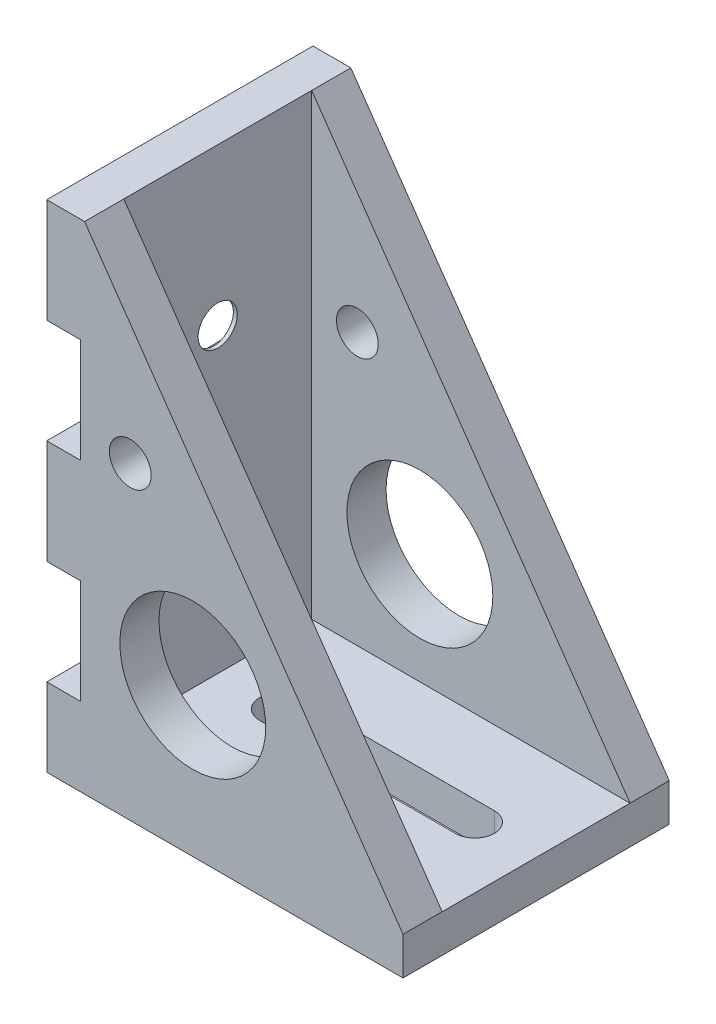
ISO-10303-21;
HEADER;
FILE_DESCRIPTION(('STEP AP214'),'2;1');
FILE_NAME('part.step','',(''),(''),'','','');
FILE_SCHEMA(('AUTOMOTIVE_DESIGN { 1 0 10303 214 1 1 1 1 }'));
ENDSEC;
DATA;
#1=APPLICATION_CONTEXT('core data for automotive mechanical design processes');
#2=APPLICATION_PROTOCOL_DEFINITION('international standard','automotive_design',2000,#1);
#3=PRODUCT_CONTEXT('',#1,'mechanical');
#4=PRODUCT('Part','Part','',(#3));
#5=PRODUCT_RELATED_PRODUCT_CATEGORY('part','',(#4));
#6=PRODUCT_DEFINITION_FORMATION('','',#4);
#7=PRODUCT_DEFINITION_CONTEXT('part definition',#1,'design');
#8=PRODUCT_DEFINITION('design','',#6,#7);
#9=PRODUCT_DEFINITION_SHAPE('','',#8);
#10=(LENGTH_UNIT() NAMED_UNIT(*) SI_UNIT(.MILLI.,.METRE.));
#11=(NAMED_UNIT(*) PLANE_ANGLE_UNIT() SI_UNIT($,.RADIAN.));
#12=(NAMED_UNIT(*) SI_UNIT($,.STERADIAN.) SOLID_ANGLE_UNIT());
#13=UNCERTAINTY_MEASURE_WITH_UNIT(LENGTH_MEASURE(1.E-05),#10,'distance_accuracy_value','');
#14=(GEOMETRIC_REPRESENTATION_CONTEXT(3) GLOBAL_UNCERTAINTY_ASSIGNED_CONTEXT((#13)) GLOBAL_UNIT_ASSIGNED_CONTEXT((#10,
#11,#12)) REPRESENTATION_CONTEXT('',''));
#15=CARTESIAN_POINT('',(0.,0.,0.));
#16=DIRECTION('',(0.,0.,1.));
#17=DIRECTION('',(1.,0.,0.));
#18=AXIS2_PLACEMENT_3D('',#15,#16,#17);
#19=CARTESIAN_POINT('',(27.3,2.9,-20.4));
#20=DIRECTION('',(0.821095876370472,0.570790295824488,0.));
#21=DIRECTION('',(-0.570790295824488,0.821095876370472,0.));
#22=AXIS2_PLACEMENT_3D('',#19,#20,#21);
#23=PLANE('',#22);
#24=DIRECTION('',(-0.570790295824488,0.821095876370472,0.));
#25=VECTOR('',#24,1.);
#26=CARTESIAN_POINT('',(27.3,2.9,-17.4));
#27=LINE('',#26,#25);
#28=CARTESIAN_POINT('',(27.3,2.9,-17.4));
#29=VERTEX_POINT('',#28);
#30=CARTESIAN_POINT('',(2.9,38.,-17.4));
#31=VERTEX_POINT('',#30);
#32=EDGE_CURVE('E243',#29,#31,#27,.T.);
#33=ORIENTED_EDGE('',*,*,#32,.F.);
#34=DIRECTION('',(0.,0.,1.));
#35=VECTOR('',#34,1.);
#36=CARTESIAN_POINT('',(27.3,2.9,-20.4));
#37=LINE('',#36,#35);
#38=CARTESIAN_POINT('',(27.3,2.9,-20.4));
#39=VERTEX_POINT('',#38);
#40=EDGE_CURVE('E355',#39,#29,#37,.T.);
#41=ORIENTED_EDGE('',*,*,#40,.F.);
#42=DIRECTION('',(-0.570790295824488,0.821095876370472,0.));
#43=VECTOR('',#42,1.);
#44=CARTESIAN_POINT('',(27.3,2.9,-20.4));
#45=LINE('',#44,#43);
#46=CARTESIAN_POINT('',(2.9,38.,-20.4));
#47=VERTEX_POINT('',#46);
#48=EDGE_CURVE('E268',#39,#47,#45,.T.);
#49=ORIENTED_EDGE('',*,*,#48,.T.);
#50=DIRECTION('',(0.,0.,1.));
#51=VECTOR('',#50,1.);
#52=CARTESIAN_POINT('',(2.9,38.,-20.4));
#53=LINE('',#52,#51);
#54=EDGE_CURVE('E351',#47,#31,#53,.T.);
#55=ORIENTED_EDGE('',*,*,#54,.T.);
#56=EDGE_LOOP('',(#33,#41,#49,#55));
#57=FACE_BOUND('',#56,.T.);
#58=ADVANCED_FACE('F34',(#57),#23,.T.);
#59=CARTESIAN_POINT('',(11.19,11.3737,-20.4));
#60=DIRECTION('',(0.,0.,1.));
#61=DIRECTION('',(1.,0.,0.));
#62=AXIS2_PLACEMENT_3D('',#59,#60,#61);
#63=CYLINDRICAL_SURFACE('',#62,5.59);
#64=CARTESIAN_POINT('',(11.19,11.3737,-17.4));
#65=DIRECTION('',(0.,0.,-1.));
#66=DIRECTION('',(-1.,0.,0.));
#67=AXIS2_PLACEMENT_3D('',#64,#65,#66);
#68=CIRCLE('',#67,5.59);
#69=CARTESIAN_POINT('',(5.6,11.3737,-17.4));
#70=VERTEX_POINT('',#69);
#71=EDGE_CURVE('E240',#70,#70,#68,.F.);
#72=ORIENTED_EDGE('',*,*,#71,.T.);
#73=EDGE_LOOP('',(#72));
#74=FACE_BOUND('',#73,.T.);
#75=CARTESIAN_POINT('',(11.19,11.3737,-20.4));
#76=DIRECTION('',(0.,0.,1.));
#77=DIRECTION('',(1.,0.,0.));
#78=AXIS2_PLACEMENT_3D('',#75,#76,#77);
#79=CIRCLE('',#78,5.59);
#80=CARTESIAN_POINT('',(16.78,11.3737,-20.4));
#81=VERTEX_POINT('',#80);
#82=EDGE_CURVE('E252',#81,#81,#79,.T.);
#83=ORIENTED_EDGE('',*,*,#82,.F.);
#84=EDGE_LOOP('',(#83));
#85=FACE_BOUND('',#84,.T.);
#86=ADVANCED_FACE('F385',(#74,#85),#63,.F.);
#87=CARTESIAN_POINT('',(6.4,23.7,-20.4));
#88=DIRECTION('',(0.,0.,1.));
#89=DIRECTION('',(1.,0.,0.));
#90=AXIS2_PLACEMENT_3D('',#87,#88,#89);
#91=CYLINDRICAL_SURFACE('',#90,1.6);
#92=CARTESIAN_POINT('',(6.4,23.7,-17.4));
#93=DIRECTION('',(0.,0.,-1.));
#94=DIRECTION('',(-1.,0.,0.));
#95=AXIS2_PLACEMENT_3D('',#92,#93,#94);
#96=CIRCLE('',#95,1.6);
#97=CARTESIAN_POINT('',(4.8,23.7,-17.4));
#98=VERTEX_POINT('',#97);
#99=EDGE_CURVE('E239',#98,#98,#96,.F.);
#100=ORIENTED_EDGE('',*,*,#99,.T.);
#101=EDGE_LOOP('',(#100));
#102=FACE_BOUND('',#101,.T.);
#103=CARTESIAN_POINT('',(6.4,23.7,-20.4));
#104=DIRECTION('',(0.,0.,1.));
#105=DIRECTION('',(1.,0.,0.));
#106=AXIS2_PLACEMENT_3D('',#103,#104,#105);
#107=CIRCLE('',#106,1.6);
#108=CARTESIAN_POINT('',(8.,23.7,-20.4));
#109=VERTEX_POINT('',#108);
#110=EDGE_CURVE('E246',#109,#109,#107,.T.);
#111=ORIENTED_EDGE('',*,*,#110,.F.);
#112=EDGE_LOOP('',(#111));
#113=FACE_BOUND('',#112,.T.);
#114=ADVANCED_FACE('F392',(#102,#113),#91,.F.);
#115=CARTESIAN_POINT('',(0.,6.,-20.4));
#116=DIRECTION('',(-1.,0.,0.));
#117=DIRECTION('',(0.,-1.,0.));
#118=AXIS2_PLACEMENT_3D('',#115,#116,#117);
#119=PLANE('',#118);
#120=DIRECTION('',(0.,-1.,0.));
#121=VECTOR('',#120,1.);
#122=CARTESIAN_POINT('',(0.,6.,0.));
#123=LINE('',#122,#121);
#124=CARTESIAN_POINT('',(0.,6.,0.));
#125=VERTEX_POINT('',#124);
#126=CARTESIAN_POINT('',(0.,0.,0.));
#127=VERTEX_POINT('',#126);
#128=EDGE_CURVE('E255',#125,#127,#123,.T.);
#129=ORIENTED_EDGE('',*,*,#128,.F.);
#130=DIRECTION('',(0.,0.,1.));
#131=VECTOR('',#130,1.);
#132=CARTESIAN_POINT('',(0.,6.,-20.4));
#133=LINE('',#132,#131);
#134=CARTESIAN_POINT('',(0.,6.,-20.4));
#135=VERTEX_POINT('',#134);
#136=EDGE_CURVE('E11',#135,#125,#133,.T.);
#137=ORIENTED_EDGE('',*,*,#136,.F.);
#138=DIRECTION('',(0.,-1.,0.));
#139=VECTOR('',#138,1.);
#140=CARTESIAN_POINT('',(0.,6.,-20.4));
#141=LINE('',#140,#139);
#142=CARTESIAN_POINT('',(0.,0.,-20.4));
#143=VERTEX_POINT('',#142);
#144=EDGE_CURVE('E258',#135,#143,#141,.T.);
#145=ORIENTED_EDGE('',*,*,#144,.T.);
#146=DIRECTION('',(0.,0.,1.));
#147=VECTOR('',#146,1.);
#148=CARTESIAN_POINT('',(0.,0.,-20.4));
#149=LINE('',#148,#147);
#150=EDGE_CURVE('E298',#143,#127,#149,.T.);
#151=ORIENTED_EDGE('',*,*,#150,.T.);
#152=EDGE_LOOP('',(#129,#137,#145,#151));
#153=FACE_BOUND('',#152,.T.);
#154=ADVANCED_FACE('F36',(#153),#119,.T.);
#155=CARTESIAN_POINT('',(2.6,6.,-20.4));
#156=DIRECTION('',(0.,1.,0.));
#157=DIRECTION('',(0.,0.,1.));
#158=AXIS2_PLACEMENT_3D('',#155,#156,#157);
#159=PLANE('',#158);
#160=DIRECTION('',(-1.,0.,0.));
#161=VECTOR('',#160,1.);
#162=CARTESIAN_POINT('',(2.6,6.,0.));
#163=LINE('',#162,#161);
#164=CARTESIAN_POINT('',(2.6,6.,0.));
#165=VERTEX_POINT('',#164);
#166=EDGE_CURVE('E262',#165,#125,#163,.T.);
#167=ORIENTED_EDGE('',*,*,#166,.F.);
#168=DIRECTION('',(0.,0.,1.));
#169=VECTOR('',#168,1.);
#170=CARTESIAN_POINT('',(2.6,6.,-20.4));
#171=LINE('',#170,#169);
#172=CARTESIAN_POINT('',(2.6,6.,-20.4));
#173=VERTEX_POINT('',#172);
#174=EDGE_CURVE('E43',#173,#165,#171,.T.);
#175=ORIENTED_EDGE('',*,*,#174,.F.);
#176=DIRECTION('',(-1.,0.,0.));
#177=VECTOR('',#176,1.);
#178=CARTESIAN_POINT('',(2.6,6.,-20.4));
#179=LINE('',#178,#177);
#180=EDGE_CURVE('E295',#173,#135,#179,.T.);
#181=ORIENTED_EDGE('',*,*,#180,.T.);
#182=ORIENTED_EDGE('',*,*,#136,.T.);
#183=EDGE_LOOP('',(#167,#175,#181,#182));
#184=FACE_BOUND('',#183,.T.);
#185=ADVANCED_FACE('F464',(#184),#159,.T.);
#186=CARTESIAN_POINT('',(2.6,14.,-20.4));
#187=DIRECTION('',(-1.,0.,0.));
#188=DIRECTION('',(0.,-1.,0.));
#189=AXIS2_PLACEMENT_3D('',#186,#187,#188);
#190=PLANE('',#189);
#191=CARTESIAN_POINT('',(2.6,10.,-10.2));
#192=DIRECTION('',(-1.,0.,0.));
#193=DIRECTION('',(0.,-1.,0.));
#194=AXIS2_PLACEMENT_3D('',#191,#192,#193);
#195=CIRCLE('',#194,1.5);
#196=CARTESIAN_POINT('',(2.6,8.5,-10.2));
#197=VERTEX_POINT('',#196);
#198=EDGE_CURVE('E210',#197,#197,#195,.T.);
#199=ORIENTED_EDGE('',*,*,#198,.F.);
#200=EDGE_LOOP('',(#199));
#201=FACE_BOUND('',#200,.T.);
#202=DIRECTION('',(0.,-1.,0.));
#203=VECTOR('',#202,1.);
#204=CARTESIAN_POINT('',(2.6,14.,0.));
#205=LINE('',#204,#203);
#206=CARTESIAN_POINT('',(2.6,14.,0.));
#207=VERTEX_POINT('',#206);
#208=EDGE_CURVE('E331',#207,#165,#205,.T.);
#209=ORIENTED_EDGE('',*,*,#208,.F.);
#210=DIRECTION('',(0.,0.,1.));
#211=VECTOR('',#210,1.);
#212=CARTESIAN_POINT('',(2.6,14.,-20.4));
#213=LINE('',#212,#211);
#214=CARTESIAN_POINT('',(2.6,14.,-20.4));
#215=VERTEX_POINT('',#214);
#216=EDGE_CURVE('E337',#215,#207,#213,.T.);
#217=ORIENTED_EDGE('',*,*,#216,.F.);
#218=DIRECTION('',(0.,-1.,0.));
#219=VECTOR('',#218,1.);
#220=CARTESIAN_POINT('',(2.6,14.,-20.4));
#221=LINE('',#220,#219);
#222=EDGE_CURVE('E292',#215,#173,#221,.T.);
#223=ORIENTED_EDGE('',*,*,#222,.T.);
#224=ORIENTED_EDGE('',*,*,#174,.T.);
#225=EDGE_LOOP('',(#209,#217,#223,#224));
#226=FACE_BOUND('',#225,.T.);
#227=ADVANCED_FACE('F461',(#201,#226),#190,.T.);
#228=CARTESIAN_POINT('',(0.,14.,-20.4));
#229=DIRECTION('',(0.,-1.,0.));
#230=DIRECTION('',(1.,0.,0.));
#231=AXIS2_PLACEMENT_3D('',#228,#229,#230);
#232=PLANE('',#231);
#233=DIRECTION('',(1.,0.,0.));
#234=VECTOR('',#233,1.);
#235=CARTESIAN_POINT('',(0.,14.,0.));
#236=LINE('',#235,#234);
#237=CARTESIAN_POINT('',(0.,14.,0.));
#238=VERTEX_POINT('',#237);
#239=EDGE_CURVE('E328',#238,#207,#236,.T.);
#240=ORIENTED_EDGE('',*,*,#239,.F.);
#241=DIRECTION('',(0.,0.,1.));
#242=VECTOR('',#241,1.);
#243=CARTESIAN_POINT('',(0.,14.,-20.4));
#244=LINE('',#243,#242);
#245=CARTESIAN_POINT('',(0.,14.,-20.4));
#246=VERTEX_POINT('',#245);
#247=EDGE_CURVE('E339',#246,#238,#244,.T.);
#248=ORIENTED_EDGE('',*,*,#247,.F.);
#249=DIRECTION('',(1.,0.,0.));
#250=VECTOR('',#249,1.);
#251=CARTESIAN_POINT('',(0.,14.,-20.4));
#252=LINE('',#251,#250);
#253=EDGE_CURVE('E289',#246,#215,#252,.T.);
#254=ORIENTED_EDGE('',*,*,#253,.T.);
#255=ORIENTED_EDGE('',*,*,#216,.T.);
#256=EDGE_LOOP('',(#240,#248,#254,#255));
#257=FACE_BOUND('',#256,.T.);
#258=ADVANCED_FACE('F457',(#257),#232,.T.);
#259=CARTESIAN_POINT('',(0.,22.,-20.4));
#260=DIRECTION('',(-1.,0.,0.));
#261=DIRECTION('',(0.,-1.,0.));
#262=AXIS2_PLACEMENT_3D('',#259,#260,#261);
#263=PLANE('',#262);
#264=DIRECTION('',(0.,-1.,0.));
#265=VECTOR('',#264,1.);
#266=CARTESIAN_POINT('',(0.,22.,0.));
#267=LINE('',#266,#265);
#268=CARTESIAN_POINT('',(0.,22.,0.));
#269=VERTEX_POINT('',#268);
#270=EDGE_CURVE('E325',#269,#238,#267,.T.);
#271=ORIENTED_EDGE('',*,*,#270,.F.);
#272=DIRECTION('',(0.,0.,1.));
#273=VECTOR('',#272,1.);
#274=CARTESIAN_POINT('',(0.,22.,-20.4));
#275=LINE('',#274,#273);
#276=CARTESIAN_POINT('',(0.,22.,-20.4));
#277=VERTEX_POINT('',#276);
#278=EDGE_CURVE('E341',#277,#269,#275,.T.);
#279=ORIENTED_EDGE('',*,*,#278,.F.);
#280=DIRECTION('',(0.,-1.,0.));
#281=VECTOR('',#280,1.);
#282=CARTESIAN_POINT('',(0.,22.,-20.4));
#283=LINE('',#282,#281);
#284=EDGE_CURVE('E286',#277,#246,#283,.T.);
#285=ORIENTED_EDGE('',*,*,#284,.T.);
#286=ORIENTED_EDGE('',*,*,#247,.T.);
#287=EDGE_LOOP('',(#271,#279,#285,#286));
#288=FACE_BOUND('',#287,.T.);
#289=ADVANCED_FACE('F453',(#288),#263,.T.);
#290=CARTESIAN_POINT('',(2.6,22.,-20.4));
#291=DIRECTION('',(0.,1.,0.));
#292=DIRECTION('',(0.,0.,1.));
#293=AXIS2_PLACEMENT_3D('',#290,#291,#292);
#294=PLANE('',#293);
#295=DIRECTION('',(-1.,0.,0.));
#296=VECTOR('',#295,1.);
#297=CARTESIAN_POINT('',(2.6,22.,0.));
#298=LINE('',#297,#296);
#299=CARTESIAN_POINT('',(2.6,22.,0.));
#300=VERTEX_POINT('',#299);
#301=EDGE_CURVE('E322',#300,#269,#298,.T.);
#302=ORIENTED_EDGE('',*,*,#301,.F.);
#303=DIRECTION('',(0.,0.,1.));
#304=VECTOR('',#303,1.);
#305=CARTESIAN_POINT('',(2.6,22.,-20.4));
#306=LINE('',#305,#304);
#307=CARTESIAN_POINT('',(2.6,22.,-20.4));
#308=VERTEX_POINT('',#307);
#309=EDGE_CURVE('E343',#308,#300,#306,.T.);
#310=ORIENTED_EDGE('',*,*,#309,.F.);
#311=DIRECTION('',(-1.,0.,0.));
#312=VECTOR('',#311,1.);
#313=CARTESIAN_POINT('',(2.6,22.,-20.4));
#314=LINE('',#313,#312);
#315=EDGE_CURVE('E283',#308,#277,#314,.T.);
#316=ORIENTED_EDGE('',*,*,#315,.T.);
#317=ORIENTED_EDGE('',*,*,#278,.T.);
#318=EDGE_LOOP('',(#302,#310,#316,#317));
#319=FACE_BOUND('',#318,.T.);
#320=ADVANCED_FACE('F449',(#319),#294,.T.);
#321=CARTESIAN_POINT('',(2.6,30.,-20.4));
#322=DIRECTION('',(-1.,0.,0.));
#323=DIRECTION('',(0.,-1.,0.));
#324=AXIS2_PLACEMENT_3D('',#321,#322,#323);
#325=PLANE('',#324);
#326=CARTESIAN_POINT('',(2.6,26.,-10.2));
#327=DIRECTION('',(-1.,0.,0.));
#328=DIRECTION('',(0.,-1.,0.));
#329=AXIS2_PLACEMENT_3D('',#326,#327,#328);
#330=CIRCLE('',#329,1.5);
#331=CARTESIAN_POINT('',(2.6,24.5,-10.2));
#332=VERTEX_POINT('',#331);
#333=EDGE_CURVE('E207',#332,#332,#330,.T.);
#334=ORIENTED_EDGE('',*,*,#333,.F.);
#335=EDGE_LOOP('',(#334));
#336=FACE_BOUND('',#335,.T.);
#337=DIRECTION('',(0.,-1.,0.));
#338=VECTOR('',#337,1.);
#339=CARTESIAN_POINT('',(2.6,30.,0.));
#340=LINE('',#339,#338);
#341=CARTESIAN_POINT('',(2.6,30.,0.));
#342=VERTEX_POINT('',#341);
#343=EDGE_CURVE('E319',#342,#300,#340,.T.);
#344=ORIENTED_EDGE('',*,*,#343,.F.);
#345=DIRECTION('',(0.,0.,1.));
#346=VECTOR('',#345,1.);
#347=CARTESIAN_POINT('',(2.6,30.,-20.4));
#348=LINE('',#347,#346);
#349=CARTESIAN_POINT('',(2.6,30.,-20.4));
#350=VERTEX_POINT('',#349);
#351=EDGE_CURVE('E345',#350,#342,#348,.T.);
#352=ORIENTED_EDGE('',*,*,#351,.F.);
#353=DIRECTION('',(0.,-1.,0.));
#354=VECTOR('',#353,1.);
#355=CARTESIAN_POINT('',(2.6,30.,-20.4));
#356=LINE('',#355,#354);
#357=EDGE_CURVE('E280',#350,#308,#356,.T.);
#358=ORIENTED_EDGE('',*,*,#357,.T.);
#359=ORIENTED_EDGE('',*,*,#309,.T.);
#360=EDGE_LOOP('',(#344,#352,#358,#359));
#361=FACE_BOUND('',#360,.T.);
#362=ADVANCED_FACE('F445',(#336,#361),#325,.T.);
#363=CARTESIAN_POINT('',(0.,30.,-20.4));
#364=DIRECTION('',(0.,-1.,0.));
#365=DIRECTION('',(0.,0.,-1.));
#366=AXIS2_PLACEMENT_3D('',#363,#364,#365);
#367=PLANE('',#366);
#368=DIRECTION('',(1.,0.,0.));
#369=VECTOR('',#368,1.);
#370=CARTESIAN_POINT('',(0.,30.,0.));
#371=LINE('',#370,#369);
#372=CARTESIAN_POINT('',(0.,30.,0.));
#373=VERTEX_POINT('',#372);
#374=EDGE_CURVE('E316',#373,#342,#371,.T.);
#375=ORIENTED_EDGE('',*,*,#374,.F.);
#376=DIRECTION('',(0.,0.,1.));
#377=VECTOR('',#376,1.);
#378=CARTESIAN_POINT('',(0.,30.,-20.4));
#379=LINE('',#378,#377);
#380=CARTESIAN_POINT('',(0.,30.,-20.4));
#381=VERTEX_POINT('',#380);
#382=EDGE_CURVE('E347',#381,#373,#379,.T.);
#383=ORIENTED_EDGE('',*,*,#382,.F.);
#384=DIRECTION('',(1.,0.,0.));
#385=VECTOR('',#384,1.);
#386=CARTESIAN_POINT('',(0.,30.,-20.4));
#387=LINE('',#386,#385);
#388=EDGE_CURVE('E277',#381,#350,#387,.T.);
#389=ORIENTED_EDGE('',*,*,#388,.T.);
#390=ORIENTED_EDGE('',*,*,#351,.T.);
#391=EDGE_LOOP('',(#375,#383,#389,#390));
#392=FACE_BOUND('',#391,.T.);
#393=ADVANCED_FACE('F443',(#392),#367,.T.);
#394=CARTESIAN_POINT('',(0.,38.,-20.4));
#395=DIRECTION('',(-1.,0.,0.));
#396=DIRECTION('',(0.,-1.,0.));
#397=AXIS2_PLACEMENT_3D('',#394,#395,#396);
#398=PLANE('',#397);
#399=DIRECTION('',(0.,-1.,0.));
#400=VECTOR('',#399,1.);
#401=CARTESIAN_POINT('',(0.,38.,0.));
#402=LINE('',#401,#400);
#403=CARTESIAN_POINT('',(0.,38.,0.));
#404=VERTEX_POINT('',#403);
#405=EDGE_CURVE('E313',#404,#373,#402,.T.);
#406=ORIENTED_EDGE('',*,*,#405,.F.);
#407=DIRECTION('',(0.,0.,1.));
#408=VECTOR('',#407,1.);
#409=CARTESIAN_POINT('',(0.,38.,-20.4));
#410=LINE('',#409,#408);
#411=CARTESIAN_POINT('',(0.,38.,-20.4));
#412=VERTEX_POINT('',#411);
#413=EDGE_CURVE('E349',#412,#404,#410,.T.);
#414=ORIENTED_EDGE('',*,*,#413,.F.);
#415=DIRECTION('',(0.,-1.,0.));
#416=VECTOR('',#415,1.);
#417=CARTESIAN_POINT('',(0.,38.,-20.4));
#418=LINE('',#417,#416);
#419=EDGE_CURVE('E274',#412,#381,#418,.T.);
#420=ORIENTED_EDGE('',*,*,#419,.T.);
#421=ORIENTED_EDGE('',*,*,#382,.T.);
#422=EDGE_LOOP('',(#406,#414,#420,#421));
#423=FACE_BOUND('',#422,.T.);
#424=ADVANCED_FACE('F409',(#423),#398,.T.);
#425=CARTESIAN_POINT('',(2.9,38.,-20.4));
#426=DIRECTION('',(0.,1.,0.));
#427=DIRECTION('',(0.,0.,1.));
#428=AXIS2_PLACEMENT_3D('',#425,#426,#427);
#429=PLANE('',#428);
#430=DIRECTION('',(-1.,0.,0.));
#431=VECTOR('',#430,1.);
#432=CARTESIAN_POINT('',(2.9,38.,0.));
#433=LINE('',#432,#431);
#434=CARTESIAN_POINT('',(2.9,38.,0.));
#435=VERTEX_POINT('',#434);
#436=EDGE_CURVE('E310',#435,#404,#433,.T.);
#437=ORIENTED_EDGE('',*,*,#436,.F.);
#438=CARTESIAN_POINT('',(2.9,38.,-3.));
#439=VERTEX_POINT('',#438);
#440=EDGE_CURVE('E354',#439,#435,#53,.T.);
#441=ORIENTED_EDGE('',*,*,#440,.F.);
#442=DIRECTION('',(0.,0.,1.));
#443=VECTOR('',#442,1.);
#444=CARTESIAN_POINT('',(2.9,38.,-17.4));
#445=LINE('',#444,#443);
#446=EDGE_CURVE('E218',#31,#439,#445,.T.);
#447=ORIENTED_EDGE('',*,*,#446,.F.);
#448=ORIENTED_EDGE('',*,*,#54,.F.);
#449=DIRECTION('',(-1.,0.,0.));
#450=VECTOR('',#449,1.);
#451=CARTESIAN_POINT('',(2.9,38.,-20.4));
#452=LINE('',#451,#450);
#453=EDGE_CURVE('E271',#47,#412,#452,.T.);
#454=ORIENTED_EDGE('',*,*,#453,.T.);
#455=ORIENTED_EDGE('',*,*,#413,.T.);
#456=EDGE_LOOP('',(#437,#441,#447,#448,#454,#455));
#457=FACE_BOUND('',#456,.T.);
#458=ADVANCED_FACE('F401',(#457),#429,.T.);
#459=DIRECTION('',(0.570790295824488,-0.821095876370472,0.));
#460=VECTOR('',#459,1.);
#461=CARTESIAN_POINT('',(27.3,2.9,-3.));
#462=LINE('',#461,#460);
#463=CARTESIAN_POINT('',(27.3,2.9,-3.));
#464=VERTEX_POINT('',#463);
#465=EDGE_CURVE('E236',#439,#464,#462,.T.);
#466=ORIENTED_EDGE('',*,*,#465,.F.);
#467=ORIENTED_EDGE('',*,*,#440,.T.);
#468=DIRECTION('',(-0.570790295824488,0.821095876370472,0.));
#469=VECTOR('',#468,1.);
#470=CARTESIAN_POINT('',(27.3,2.9,0.));
#471=LINE('',#470,#469);
#472=CARTESIAN_POINT('',(27.3,2.9,0.));
#473=VERTEX_POINT('',#472);
#474=EDGE_CURVE('E307',#473,#435,#471,.T.);
#475=ORIENTED_EDGE('',*,*,#474,.F.);
#476=EDGE_CURVE('E358',#464,#473,#37,.T.);
#477=ORIENTED_EDGE('',*,*,#476,.F.);
#478=EDGE_LOOP('',(#466,#467,#475,#477));
#479=FACE_BOUND('',#478,.T.);
#480=ADVANCED_FACE('F388',(#479),#23,.T.);
#481=CARTESIAN_POINT('',(27.3,0.,-20.4));
#482=DIRECTION('',(1.,0.,0.));
#483=DIRECTION('',(0.,0.,-1.));
#484=AXIS2_PLACEMENT_3D('',#481,#482,#483);
#485=PLANE('',#484);
#486=DIRECTION('',(0.,1.,0.));
#487=VECTOR('',#486,1.);
#488=CARTESIAN_POINT('',(27.3,0.,0.));
#489=LINE('',#488,#487);
#490=CARTESIAN_POINT('',(27.3,0.,0.));
#491=VERTEX_POINT('',#490);
#492=EDGE_CURVE('E304',#491,#473,#489,.T.);
#493=ORIENTED_EDGE('',*,*,#492,.F.);
#494=DIRECTION('',(0.,0.,1.));
#495=VECTOR('',#494,1.);
#496=CARTESIAN_POINT('',(27.3,0.,-20.4));
#497=LINE('',#496,#495);
#498=CARTESIAN_POINT('',(27.3,0.,-20.4));
#499=VERTEX_POINT('',#498);
#500=EDGE_CURVE('E359',#499,#491,#497,.T.);
#501=ORIENTED_EDGE('',*,*,#500,.F.);
#502=DIRECTION('',(0.,1.,0.));
#503=VECTOR('',#502,1.);
#504=CARTESIAN_POINT('',(27.3,0.,-20.4));
#505=LINE('',#504,#503);
#506=EDGE_CURVE('E265',#499,#39,#505,.T.);
#507=ORIENTED_EDGE('',*,*,#506,.T.);
#508=ORIENTED_EDGE('',*,*,#40,.T.);
#509=DIRECTION('',(0.,0.,-1.));
#510=VECTOR('',#509,1.);
#511=CARTESIAN_POINT('',(27.3,2.9,-17.4));
#512=LINE('',#511,#510);
#513=EDGE_CURVE('E220',#464,#29,#512,.T.);
#514=ORIENTED_EDGE('',*,*,#513,.F.);
#515=ORIENTED_EDGE('',*,*,#476,.T.);
#516=EDGE_LOOP('',(#493,#501,#507,#508,#514,#515));
#517=FACE_BOUND('',#516,.T.);
#518=ADVANCED_FACE('F400',(#517),#485,.T.);
#519=CARTESIAN_POINT('',(0.,0.,-20.4));
#520=DIRECTION('',(0.,-1.,0.));
#521=DIRECTION('',(0.,0.,-1.));
#522=AXIS2_PLACEMENT_3D('',#519,#520,#521);
#523=PLANE('',#522);
#524=CARTESIAN_POINT('',(22.6,0.,-10.2));
#525=DIRECTION('',(0.,-1.,0.));
#526=DIRECTION('',(0.,0.,-1.));
#527=AXIS2_PLACEMENT_3D('',#524,#525,#526);
#528=CIRCLE('',#527,1.5);
#529=CARTESIAN_POINT('',(22.6,0.,-11.7));
#530=VERTEX_POINT('',#529);
#531=CARTESIAN_POINT('',(22.6,0.,-8.7));
#532=VERTEX_POINT('',#531);
#533=EDGE_CURVE('E205',#530,#532,#528,.T.);
#534=ORIENTED_EDGE('',*,*,#533,.F.);
#535=DIRECTION('',(1.,0.,0.));
#536=VECTOR('',#535,1.);
#537=CARTESIAN_POINT('',(0.,0.,-11.7));
#538=LINE('',#537,#536);
#539=CARTESIAN_POINT('',(7.6,0.,-11.7));
#540=VERTEX_POINT('',#539);
#541=EDGE_CURVE('E198',#540,#530,#538,.T.);
#542=ORIENTED_EDGE('',*,*,#541,.F.);
#543=CARTESIAN_POINT('',(7.6,0.,-10.2));
#544=DIRECTION('',(0.,-1.,0.));
#545=DIRECTION('',(0.,0.,-1.));
#546=AXIS2_PLACEMENT_3D('',#543,#544,#545);
#547=CIRCLE('',#546,1.5);
#548=CARTESIAN_POINT('',(7.6,0.,-8.7));
#549=VERTEX_POINT('',#548);
#550=EDGE_CURVE('E178',#549,#540,#547,.T.);
#551=ORIENTED_EDGE('',*,*,#550,.F.);
#552=DIRECTION('',(-1.,0.,0.));
#553=VECTOR('',#552,1.);
#554=CARTESIAN_POINT('',(0.,0.,-8.7));
#555=LINE('',#554,#553);
#556=EDGE_CURVE('E203',#532,#549,#555,.T.);
#557=ORIENTED_EDGE('',*,*,#556,.F.);
#558=EDGE_LOOP('',(#534,#542,#551,#557));
#559=FACE_BOUND('',#558,.T.);
#560=DIRECTION('',(1.,0.,0.));
#561=VECTOR('',#560,1.);
#562=CARTESIAN_POINT('',(0.,0.,0.));
#563=LINE('',#562,#561);
#564=EDGE_CURVE('E301',#127,#491,#563,.T.);
#565=ORIENTED_EDGE('',*,*,#564,.F.);
#566=ORIENTED_EDGE('',*,*,#150,.F.);
#567=DIRECTION('',(1.,0.,0.));
#568=VECTOR('',#567,1.);
#569=CARTESIAN_POINT('',(0.,0.,-20.4));
#570=LINE('',#569,#568);
#571=EDGE_CURVE('E261',#143,#499,#570,.T.);
#572=ORIENTED_EDGE('',*,*,#571,.T.);
#573=ORIENTED_EDGE('',*,*,#500,.T.);
#574=EDGE_LOOP('',(#565,#566,#572,#573));
#575=FACE_BOUND('',#574,.T.);
#576=ADVANCED_FACE('F407',(#559,#575),#523,.T.);
#577=CARTESIAN_POINT('',(0.,0.,-20.4));
#578=DIRECTION('',(0.,0.,1.));
#579=DIRECTION('',(1.,0.,0.));
#580=AXIS2_PLACEMENT_3D('',#577,#578,#579);
#581=PLANE('',#580);
#582=ORIENTED_EDGE('',*,*,#110,.T.);
#583=EDGE_LOOP('',(#582));
#584=FACE_BOUND('',#583,.T.);
#585=ORIENTED_EDGE('',*,*,#82,.T.);
#586=EDGE_LOOP('',(#585));
#587=FACE_BOUND('',#586,.T.);
#588=ORIENTED_EDGE('',*,*,#144,.F.);
#589=ORIENTED_EDGE('',*,*,#180,.F.);
#590=ORIENTED_EDGE('',*,*,#222,.F.);
#591=ORIENTED_EDGE('',*,*,#253,.F.);
#592=ORIENTED_EDGE('',*,*,#284,.F.);
#593=ORIENTED_EDGE('',*,*,#315,.F.);
#594=ORIENTED_EDGE('',*,*,#357,.F.);
#595=ORIENTED_EDGE('',*,*,#388,.F.);
#596=ORIENTED_EDGE('',*,*,#419,.F.);
#597=ORIENTED_EDGE('',*,*,#453,.F.);
#598=ORIENTED_EDGE('',*,*,#48,.F.);
#599=ORIENTED_EDGE('',*,*,#506,.F.);
#600=ORIENTED_EDGE('',*,*,#571,.F.);
#601=EDGE_LOOP('',(#588,#589,#590,#591,#592,#593,#594,#595,#596,#597,#598,#599,#600));
#602=FACE_BOUND('',#601,.T.);
#603=ADVANCED_FACE('F436',(#584,#587,#602),#581,.F.);
#604=CARTESIAN_POINT('',(0.,0.,0.));
#605=DIRECTION('',(0.,0.,1.));
#606=DIRECTION('',(1.,0.,0.));
#607=AXIS2_PLACEMENT_3D('',#604,#605,#606);
#608=PLANE('',#607);
#609=CARTESIAN_POINT('',(6.4,23.7,0.));
#610=DIRECTION('',(0.,0.,1.));
#611=DIRECTION('',(1.,0.,0.));
#612=AXIS2_PLACEMENT_3D('',#609,#610,#611);
#613=CIRCLE('',#612,1.6);
#614=CARTESIAN_POINT('',(8.,23.7,0.));
#615=VERTEX_POINT('',#614);
#616=EDGE_CURVE('E245',#615,#615,#613,.T.);
#617=ORIENTED_EDGE('',*,*,#616,.F.);
#618=EDGE_LOOP('',(#617));
#619=FACE_BOUND('',#618,.T.);
#620=CARTESIAN_POINT('',(11.19,11.3737,0.));
#621=DIRECTION('',(0.,0.,1.));
#622=DIRECTION('',(1.,0.,0.));
#623=AXIS2_PLACEMENT_3D('',#620,#621,#622);
#624=CIRCLE('',#623,5.59);
#625=CARTESIAN_POINT('',(16.78,11.3737,0.));
#626=VERTEX_POINT('',#625);
#627=EDGE_CURVE('E249',#626,#626,#624,.T.);
#628=ORIENTED_EDGE('',*,*,#627,.F.);
#629=EDGE_LOOP('',(#628));
#630=FACE_BOUND('',#629,.T.);
#631=ORIENTED_EDGE('',*,*,#128,.T.);
#632=ORIENTED_EDGE('',*,*,#564,.T.);
#633=ORIENTED_EDGE('',*,*,#492,.T.);
#634=ORIENTED_EDGE('',*,*,#474,.T.);
#635=ORIENTED_EDGE('',*,*,#436,.T.);
#636=ORIENTED_EDGE('',*,*,#405,.T.);
#637=ORIENTED_EDGE('',*,*,#374,.T.);
#638=ORIENTED_EDGE('',*,*,#343,.T.);
#639=ORIENTED_EDGE('',*,*,#301,.T.);
#640=ORIENTED_EDGE('',*,*,#270,.T.);
#641=ORIENTED_EDGE('',*,*,#239,.T.);
#642=ORIENTED_EDGE('',*,*,#208,.T.);
#643=ORIENTED_EDGE('',*,*,#166,.T.);
#644=EDGE_LOOP('',(#631,#632,#633,#634,#635,#636,#637,#638,#639,#640,#641,#642,#643));
#645=FACE_BOUND('',#644,.T.);
#646=ADVANCED_FACE('F422',(#619,#630,#645),#608,.T.);
#647=CARTESIAN_POINT('',(11.19,11.3737,-3.));
#648=DIRECTION('',(0.,0.,1.));
#649=DIRECTION('',(1.,0.,0.));
#650=AXIS2_PLACEMENT_3D('',#647,#648,#649);
#651=CIRCLE('',#650,5.59);
#652=CARTESIAN_POINT('',(16.78,11.3737,-3.));
#653=VERTEX_POINT('',#652);
#654=EDGE_CURVE('E233',#653,#653,#651,.F.);
#655=ORIENTED_EDGE('',*,*,#654,.T.);
#656=EDGE_LOOP('',(#655));
#657=FACE_BOUND('',#656,.T.);
#658=ORIENTED_EDGE('',*,*,#627,.T.);
#659=EDGE_LOOP('',(#658));
#660=FACE_BOUND('',#659,.T.);
#661=ADVANCED_FACE('F395',(#657,#660),#63,.F.);
#662=CARTESIAN_POINT('',(6.4,23.7,-3.));
#663=DIRECTION('',(0.,0.,1.));
#664=DIRECTION('',(1.,0.,0.));
#665=AXIS2_PLACEMENT_3D('',#662,#663,#664);
#666=CIRCLE('',#665,1.6);
#667=CARTESIAN_POINT('',(8.,23.7,-3.));
#668=VERTEX_POINT('',#667);
#669=EDGE_CURVE('E231',#668,#668,#666,.F.);
#670=ORIENTED_EDGE('',*,*,#669,.T.);
#671=EDGE_LOOP('',(#670));
#672=FACE_BOUND('',#671,.T.);
#673=ORIENTED_EDGE('',*,*,#616,.T.);
#674=EDGE_LOOP('',(#673));
#675=FACE_BOUND('',#674,.T.);
#676=ADVANCED_FACE('F583',(#672,#675),#91,.F.);
#677=CARTESIAN_POINT('',(2.9,2.9,-17.4));
#678=DIRECTION('',(0.,0.,-1.));
#679=DIRECTION('',(-1.,0.,0.));
#680=AXIS2_PLACEMENT_3D('',#677,#678,#679);
#681=PLANE('',#680);
#682=ORIENTED_EDGE('',*,*,#32,.T.);
#683=DIRECTION('',(0.,1.,0.));
#684=VECTOR('',#683,1.);
#685=CARTESIAN_POINT('',(2.9,2.9,-17.4));
#686=LINE('',#685,#684);
#687=CARTESIAN_POINT('',(2.9,2.9,-17.4));
#688=VERTEX_POINT('',#687);
#689=EDGE_CURVE('E228',#688,#31,#686,.T.);
#690=ORIENTED_EDGE('',*,*,#689,.F.);
#691=DIRECTION('',(-1.,0.,0.));
#692=VECTOR('',#691,1.);
#693=CARTESIAN_POINT('',(2.9,2.9,-17.4));
#694=LINE('',#693,#692);
#695=EDGE_CURVE('E222',#29,#688,#694,.T.);
#696=ORIENTED_EDGE('',*,*,#695,.F.);
#697=EDGE_LOOP('',(#682,#690,#696));
#698=FACE_BOUND('',#697,.T.);
#699=ORIENTED_EDGE('',*,*,#99,.F.);
#700=EDGE_LOOP('',(#699));
#701=FACE_BOUND('',#700,.T.);
#702=ORIENTED_EDGE('',*,*,#71,.F.);
#703=EDGE_LOOP('',(#702));
#704=FACE_BOUND('',#703,.T.);
#705=ADVANCED_FACE('F428',(#698,#701,#704),#681,.F.);
#706=CARTESIAN_POINT('',(2.9,2.9,-3.));
#707=DIRECTION('',(0.,0.,1.));
#708=DIRECTION('',(1.,0.,0.));
#709=AXIS2_PLACEMENT_3D('',#706,#707,#708);
#710=PLANE('',#709);
#711=ORIENTED_EDGE('',*,*,#465,.T.);
#712=DIRECTION('',(1.,0.,0.));
#713=VECTOR('',#712,1.);
#714=CARTESIAN_POINT('',(2.9,2.9,-3.));
#715=LINE('',#714,#713);
#716=CARTESIAN_POINT('',(2.9,2.9,-3.));
#717=VERTEX_POINT('',#716);
#718=EDGE_CURVE('E217',#717,#464,#715,.T.);
#719=ORIENTED_EDGE('',*,*,#718,.F.);
#720=DIRECTION('',(0.,1.,0.));
#721=VECTOR('',#720,1.);
#722=CARTESIAN_POINT('',(2.9,2.9,-3.));
#723=LINE('',#722,#721);
#724=EDGE_CURVE('E225',#717,#439,#723,.T.);
#725=ORIENTED_EDGE('',*,*,#724,.T.);
#726=EDGE_LOOP('',(#711,#719,#725));
#727=FACE_BOUND('',#726,.T.);
#728=ORIENTED_EDGE('',*,*,#669,.F.);
#729=EDGE_LOOP('',(#728));
#730=FACE_BOUND('',#729,.T.);
#731=ORIENTED_EDGE('',*,*,#654,.F.);
#732=EDGE_LOOP('',(#731));
#733=FACE_BOUND('',#732,.T.);
#734=ADVANCED_FACE('F539',(#727,#730,#733),#710,.F.);
#735=CARTESIAN_POINT('',(2.9,2.9,-17.4));
#736=DIRECTION('',(-1.,0.,0.));
#737=DIRECTION('',(0.,0.,1.));
#738=AXIS2_PLACEMENT_3D('',#735,#736,#737);
#739=PLANE('',#738);
#740=CARTESIAN_POINT('',(2.9,26.,-10.2));
#741=DIRECTION('',(-1.,0.,0.));
#742=DIRECTION('',(0.,0.,1.));
#743=AXIS2_PLACEMENT_3D('',#740,#741,#742);
#744=CIRCLE('',#743,1.5);
#745=CARTESIAN_POINT('',(2.9,26.,-8.7));
#746=VERTEX_POINT('',#745);
#747=EDGE_CURVE('E38',#746,#746,#744,.T.);
#748=ORIENTED_EDGE('',*,*,#747,.T.);
#749=EDGE_LOOP('',(#748));
#750=FACE_BOUND('',#749,.T.);
#751=CARTESIAN_POINT('',(2.9,10.,-10.2));
#752=DIRECTION('',(-1.,0.,0.));
#753=DIRECTION('',(0.,0.,1.));
#754=AXIS2_PLACEMENT_3D('',#751,#752,#753);
#755=CIRCLE('',#754,1.5);
#756=CARTESIAN_POINT('',(2.9,10.,-8.7));
#757=VERTEX_POINT('',#756);
#758=EDGE_CURVE('E213',#757,#757,#755,.T.);
#759=ORIENTED_EDGE('',*,*,#758,.T.);
#760=EDGE_LOOP('',(#759));
#761=FACE_BOUND('',#760,.T.);
#762=ORIENTED_EDGE('',*,*,#446,.T.);
#763=ORIENTED_EDGE('',*,*,#724,.F.);
#764=DIRECTION('',(0.,0.,1.));
#765=VECTOR('',#764,1.);
#766=CARTESIAN_POINT('',(2.9,2.9,-17.4));
#767=LINE('',#766,#765);
#768=EDGE_CURVE('E214',#688,#717,#767,.T.);
#769=ORIENTED_EDGE('',*,*,#768,.F.);
#770=ORIENTED_EDGE('',*,*,#689,.T.);
#771=EDGE_LOOP('',(#762,#763,#769,#770));
#772=FACE_BOUND('',#771,.T.);
#773=ADVANCED_FACE('F368',(#750,#761,#772),#739,.F.);
#774=CARTESIAN_POINT('',(0.,2.9,0.));
#775=DIRECTION('',(0.,1.,0.));
#776=DIRECTION('',(0.,0.,1.));
#777=AXIS2_PLACEMENT_3D('',#774,#775,#776);
#778=PLANE('',#777);
#779=CARTESIAN_POINT('',(22.6,2.9,-10.2));
#780=DIRECTION('',(0.,1.,0.));
#781=DIRECTION('',(0.,0.,1.));
#782=AXIS2_PLACEMENT_3D('',#779,#780,#781);
#783=CIRCLE('',#782,1.5);
#784=CARTESIAN_POINT('',(22.6,2.9,-8.7));
#785=VERTEX_POINT('',#784);
#786=CARTESIAN_POINT('',(22.6,2.9,-11.7));
#787=VERTEX_POINT('',#786);
#788=EDGE_CURVE('E59',#785,#787,#783,.T.);
#789=ORIENTED_EDGE('',*,*,#788,.F.);
#790=DIRECTION('',(1.,0.,0.));
#791=VECTOR('',#790,1.);
#792=CARTESIAN_POINT('',(22.6,2.9,-8.7));
#793=LINE('',#792,#791);
#794=CARTESIAN_POINT('',(7.6,2.9,-8.7));
#795=VERTEX_POINT('',#794);
#796=EDGE_CURVE('E191',#795,#785,#793,.T.);
#797=ORIENTED_EDGE('',*,*,#796,.F.);
#798=CARTESIAN_POINT('',(7.6,2.9,-10.2));
#799=DIRECTION('',(0.,1.,0.));
#800=DIRECTION('',(0.,0.,1.));
#801=AXIS2_PLACEMENT_3D('',#798,#799,#800);
#802=CIRCLE('',#801,1.5);
#803=CARTESIAN_POINT('',(7.6,2.9,-11.7));
#804=VERTEX_POINT('',#803);
#805=EDGE_CURVE('E175',#804,#795,#802,.T.);
#806=ORIENTED_EDGE('',*,*,#805,.F.);
#807=DIRECTION('',(-1.,0.,0.));
#808=VECTOR('',#807,1.);
#809=CARTESIAN_POINT('',(22.6,2.9,-11.7));
#810=LINE('',#809,#808);
#811=EDGE_CURVE('E184',#787,#804,#810,.T.);
#812=ORIENTED_EDGE('',*,*,#811,.F.);
#813=EDGE_LOOP('',(#789,#797,#806,#812));
#814=FACE_BOUND('',#813,.T.);
#815=ORIENTED_EDGE('',*,*,#768,.T.);
#816=ORIENTED_EDGE('',*,*,#718,.T.);
#817=ORIENTED_EDGE('',*,*,#513,.T.);
#818=ORIENTED_EDGE('',*,*,#695,.T.);
#819=EDGE_LOOP('',(#815,#816,#817,#818));
#820=FACE_BOUND('',#819,.T.);
#821=ADVANCED_FACE('F188',(#814,#820),#778,.T.);
#822=CARTESIAN_POINT('',(12.6,10.,-10.2));
#823=DIRECTION('',(-1.,0.,0.));
#824=DIRECTION('',(0.,-1.,0.));
#825=AXIS2_PLACEMENT_3D('',#822,#823,#824);
#826=CYLINDRICAL_SURFACE('',#825,1.5);
#827=ORIENTED_EDGE('',*,*,#198,.T.);
#828=EDGE_LOOP('',(#827));
#829=FACE_BOUND('',#828,.T.);
#830=ORIENTED_EDGE('',*,*,#758,.F.);
#831=EDGE_LOOP('',(#830));
#832=FACE_BOUND('',#831,.T.);
#833=ADVANCED_FACE('F371',(#829,#832),#826,.F.);
#834=CARTESIAN_POINT('',(12.6,26.,-10.2));
#835=DIRECTION('',(-1.,0.,0.));
#836=DIRECTION('',(0.,-1.,0.));
#837=AXIS2_PLACEMENT_3D('',#834,#835,#836);
#838=CYLINDRICAL_SURFACE('',#837,1.5);
#839=ORIENTED_EDGE('',*,*,#333,.T.);
#840=EDGE_LOOP('',(#839));
#841=FACE_BOUND('',#840,.T.);
#842=ORIENTED_EDGE('',*,*,#747,.F.);
#843=EDGE_LOOP('',(#842));
#844=FACE_BOUND('',#843,.T.);
#845=ADVANCED_FACE('F373',(#841,#844),#838,.F.);
#846=CARTESIAN_POINT('',(22.6,-7.1,-10.2));
#847=DIRECTION('',(0.,1.,0.));
#848=DIRECTION('',(0.,0.,1.));
#849=AXIS2_PLACEMENT_3D('',#846,#847,#848);
#850=CYLINDRICAL_SURFACE('',#849,1.5);
#851=ORIENTED_EDGE('',*,*,#533,.T.);
#852=DIRECTION('',(0.,1.,0.));
#853=VECTOR('',#852,1.);
#854=CARTESIAN_POINT('',(22.6,-7.1,-8.7));
#855=LINE('',#854,#853);
#856=EDGE_CURVE('E196',#532,#785,#855,.T.);
#857=ORIENTED_EDGE('',*,*,#856,.T.);
#858=ORIENTED_EDGE('',*,*,#788,.T.);
#859=DIRECTION('',(0.,1.,0.));
#860=VECTOR('',#859,1.);
#861=CARTESIAN_POINT('',(22.6,-7.1,-11.7));
#862=LINE('',#861,#860);
#863=EDGE_CURVE('E181',#530,#787,#862,.T.);
#864=ORIENTED_EDGE('',*,*,#863,.F.);
#865=EDGE_LOOP('',(#851,#857,#858,#864));
#866=FACE_BOUND('',#865,.T.);
#867=ADVANCED_FACE('F380',(#866),#850,.F.);
#868=CARTESIAN_POINT('',(22.6,-7.1,-8.7));
#869=DIRECTION('',(0.,0.,1.));
#870=DIRECTION('',(1.,0.,0.));
#871=AXIS2_PLACEMENT_3D('',#868,#869,#870);
#872=PLANE('',#871);
#873=ORIENTED_EDGE('',*,*,#556,.T.);
#874=DIRECTION('',(0.,1.,0.));
#875=VECTOR('',#874,1.);
#876=CARTESIAN_POINT('',(7.6,-7.1,-8.7));
#877=LINE('',#876,#875);
#878=EDGE_CURVE('E180',#549,#795,#877,.T.);
#879=ORIENTED_EDGE('',*,*,#878,.T.);
#880=ORIENTED_EDGE('',*,*,#796,.T.);
#881=ORIENTED_EDGE('',*,*,#856,.F.);
#882=EDGE_LOOP('',(#873,#879,#880,#881));
#883=FACE_BOUND('',#882,.T.);
#884=ADVANCED_FACE('F481',(#883),#872,.F.);
#885=CARTESIAN_POINT('',(7.6,-7.1,-10.2));
#886=DIRECTION('',(0.,1.,0.));
#887=DIRECTION('',(0.,0.,1.));
#888=AXIS2_PLACEMENT_3D('',#885,#886,#887);
#889=CYLINDRICAL_SURFACE('',#888,1.5);
#890=ORIENTED_EDGE('',*,*,#550,.T.);
#891=DIRECTION('',(0.,1.,0.));
#892=VECTOR('',#891,1.);
#893=CARTESIAN_POINT('',(7.6,-7.1,-11.7));
#894=LINE('',#893,#892);
#895=EDGE_CURVE('E51',#540,#804,#894,.T.);
#896=ORIENTED_EDGE('',*,*,#895,.T.);
#897=ORIENTED_EDGE('',*,*,#805,.T.);
#898=ORIENTED_EDGE('',*,*,#878,.F.);
#899=EDGE_LOOP('',(#890,#896,#897,#898));
#900=FACE_BOUND('',#899,.T.);
#901=ADVANCED_FACE('F172',(#900),#889,.F.);
#902=CARTESIAN_POINT('',(22.6,-7.1,-11.7));
#903=DIRECTION('',(0.,0.,-1.));
#904=DIRECTION('',(-1.,0.,0.));
#905=AXIS2_PLACEMENT_3D('',#902,#903,#904);
#906=PLANE('',#905);
#907=ORIENTED_EDGE('',*,*,#541,.T.);
#908=ORIENTED_EDGE('',*,*,#863,.T.);
#909=ORIENTED_EDGE('',*,*,#811,.T.);
#910=ORIENTED_EDGE('',*,*,#895,.F.);
#911=EDGE_LOOP('',(#907,#908,#909,#910));
#912=FACE_BOUND('',#911,.T.);
#913=ADVANCED_FACE('F185',(#912),#906,.F.);
#914=CLOSED_SHELL('',(#58,#86,#114,#154,#185,#227,#258,#289,#320,#362,#393,#424,#458,#480,#518,
#576,#603,#646,#661,#676,#705,#734,#773,#821,#833,#845,#867,#884,#901,#913));
#915=MANIFOLD_SOLID_BREP('B2',#914);
#916=ADVANCED_BREP_SHAPE_REPRESENTATION('',(#18,#915),#14);
#917=SHAPE_DEFINITION_REPRESENTATION(#9,#916);
ENDSEC;
END-ISO-10303-21;
